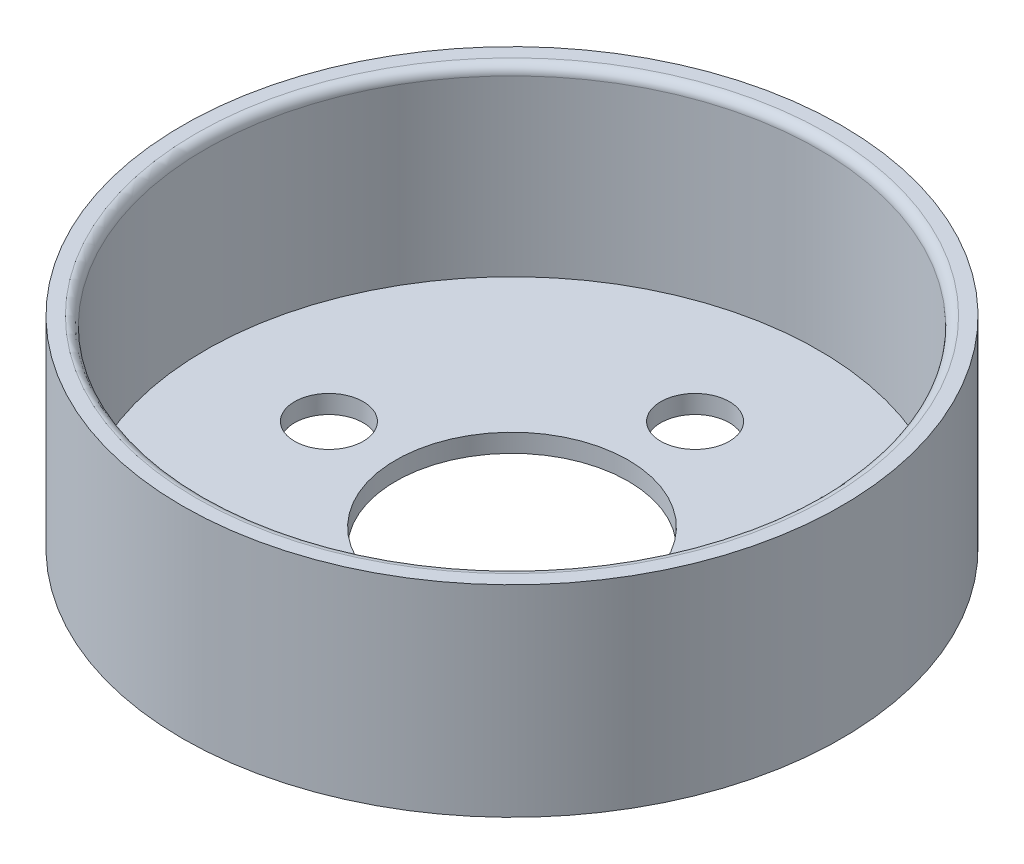
ISO-10303-21;
HEADER;
FILE_DESCRIPTION(('STEP AP214'),'2;1');
FILE_NAME('part.step','',(''),(''),'','','');
FILE_SCHEMA(('AUTOMOTIVE_DESIGN { 1 0 10303 214 1 1 1 1 }'));
ENDSEC;
DATA;
#1=APPLICATION_CONTEXT('core data for automotive mechanical design processes');
#2=APPLICATION_PROTOCOL_DEFINITION('international standard','automotive_design',2000,#1);
#3=PRODUCT_CONTEXT('',#1,'mechanical');
#4=PRODUCT('Part','Part','',(#3));
#5=PRODUCT_RELATED_PRODUCT_CATEGORY('part','',(#4));
#6=PRODUCT_DEFINITION_FORMATION('','',#4);
#7=PRODUCT_DEFINITION_CONTEXT('part definition',#1,'design');
#8=PRODUCT_DEFINITION('design','',#6,#7);
#9=PRODUCT_DEFINITION_SHAPE('','',#8);
#10=(LENGTH_UNIT() NAMED_UNIT(*) SI_UNIT(.MILLI.,.METRE.));
#11=(NAMED_UNIT(*) PLANE_ANGLE_UNIT() SI_UNIT($,.RADIAN.));
#12=(NAMED_UNIT(*) SI_UNIT($,.STERADIAN.) SOLID_ANGLE_UNIT());
#13=UNCERTAINTY_MEASURE_WITH_UNIT(LENGTH_MEASURE(1.E-05),#10,'distance_accuracy_value','');
#14=(GEOMETRIC_REPRESENTATION_CONTEXT(3) GLOBAL_UNCERTAINTY_ASSIGNED_CONTEXT((#13)) GLOBAL_UNIT_ASSIGNED_CONTEXT((#10,
#11,#12)) REPRESENTATION_CONTEXT('',''));
#15=CARTESIAN_POINT('',(0.,0.,0.));
#16=DIRECTION('',(0.,0.,1.));
#17=DIRECTION('',(1.,0.,0.));
#18=AXIS2_PLACEMENT_3D('',#15,#16,#17);
#19=CARTESIAN_POINT('',(0.,2.54,0.));
#20=DIRECTION('',(0.,-1.,0.));
#21=DIRECTION('',(0.,0.,-1.));
#22=AXIS2_PLACEMENT_3D('',#19,#20,#21);
#23=CYLINDRICAL_SURFACE('',#22,45.72);
#24=CARTESIAN_POINT('',(0.,0.,0.));
#25=DIRECTION('',(0.,1.,0.));
#26=DIRECTION('',(0.,0.,1.));
#27=AXIS2_PLACEMENT_3D('',#24,#25,#26);
#28=CIRCLE('',#27,45.72);
#29=CARTESIAN_POINT('',(0.,0.,45.72));
#30=VERTEX_POINT('',#29);
#31=EDGE_CURVE('E61',#30,#30,#28,.T.);
#32=ORIENTED_EDGE('',*,*,#31,.T.);
#33=EDGE_LOOP('',(#32));
#34=FACE_BOUND('',#33,.T.);
#35=CARTESIAN_POINT('',(0.,27.94,0.));
#36=DIRECTION('',(0.,1.,0.));
#37=DIRECTION('',(0.,0.,1.));
#38=AXIS2_PLACEMENT_3D('',#35,#36,#37);
#39=CIRCLE('',#38,45.72);
#40=CARTESIAN_POINT('',(0.,27.94,45.72));
#41=VERTEX_POINT('',#40);
#42=EDGE_CURVE('E67',#41,#41,#39,.T.);
#43=ORIENTED_EDGE('',*,*,#42,.F.);
#44=EDGE_LOOP('',(#43));
#45=FACE_BOUND('',#44,.T.);
#46=ADVANCED_FACE('F43',(#34,#45),#23,.T.);
#47=CARTESIAN_POINT('',(0.,0.,0.));
#48=DIRECTION('',(0.,1.,0.));
#49=DIRECTION('',(0.,0.,1.));
#50=AXIS2_PLACEMENT_3D('',#47,#48,#49);
#51=PLANE('',#50);
#52=CARTESIAN_POINT('',(25.4,0.,0.));
#53=DIRECTION('',(0.,1.,0.));
#54=DIRECTION('',(0.,0.,1.));
#55=AXIS2_PLACEMENT_3D('',#52,#53,#54);
#56=CIRCLE('',#55,4.7625);
#57=CARTESIAN_POINT('',(25.4,0.,4.76250000000009));
#58=VERTEX_POINT('',#57);
#59=EDGE_CURVE('E87',#58,#58,#56,.F.);
#60=ORIENTED_EDGE('',*,*,#59,.F.);
#61=EDGE_LOOP('',(#60));
#62=FACE_BOUND('',#61,.T.);
#63=CARTESIAN_POINT('',(0.,0.,25.4));
#64=DIRECTION('',(0.,1.,0.));
#65=DIRECTION('',(0.,0.,1.));
#66=AXIS2_PLACEMENT_3D('',#63,#64,#65);
#67=CIRCLE('',#66,4.7625);
#68=CARTESIAN_POINT('',(0.,0.,30.1625));
#69=VERTEX_POINT('',#68);
#70=EDGE_CURVE('E97',#69,#69,#67,.F.);
#71=ORIENTED_EDGE('',*,*,#70,.F.);
#72=EDGE_LOOP('',(#71));
#73=FACE_BOUND('',#72,.T.);
#74=CARTESIAN_POINT('',(-25.4,0.,-2.66050878019847E-13));
#75=DIRECTION('',(0.,1.,0.));
#76=DIRECTION('',(0.,0.,1.));
#77=AXIS2_PLACEMENT_3D('',#74,#75,#76);
#78=CIRCLE('',#77,4.7625);
#79=CARTESIAN_POINT('',(-25.4,0.,4.76249999999973));
#80=VERTEX_POINT('',#79);
#81=EDGE_CURVE('E88',#80,#80,#78,.F.);
#82=ORIENTED_EDGE('',*,*,#81,.F.);
#83=EDGE_LOOP('',(#82));
#84=FACE_BOUND('',#83,.T.);
#85=CARTESIAN_POINT('',(0.,0.,-25.4));
#86=DIRECTION('',(0.,1.,0.));
#87=DIRECTION('',(0.,0.,1.));
#88=AXIS2_PLACEMENT_3D('',#85,#86,#87);
#89=CIRCLE('',#88,4.7625);
#90=CARTESIAN_POINT('',(0.,0.,-20.6375));
#91=VERTEX_POINT('',#90);
#92=EDGE_CURVE('E76',#91,#91,#89,.F.);
#93=ORIENTED_EDGE('',*,*,#92,.F.);
#94=EDGE_LOOP('',(#93));
#95=FACE_BOUND('',#94,.T.);
#96=CARTESIAN_POINT('',(0.,0.,0.));
#97=DIRECTION('',(0.,-1.,0.));
#98=DIRECTION('',(0.,0.,-1.));
#99=AXIS2_PLACEMENT_3D('',#96,#97,#98);
#100=CIRCLE('',#99,16.129);
#101=CARTESIAN_POINT('',(0.,0.,-16.129));
#102=VERTEX_POINT('',#101);
#103=EDGE_CURVE('E71',#102,#102,#100,.T.);
#104=ORIENTED_EDGE('',*,*,#103,.F.);
#105=EDGE_LOOP('',(#104));
#106=FACE_BOUND('',#105,.T.);
#107=ORIENTED_EDGE('',*,*,#31,.F.);
#108=EDGE_LOOP('',(#107));
#109=FACE_BOUND('',#108,.T.);
#110=ADVANCED_FACE('F137',(#62,#73,#84,#95,#106,#109),#51,.F.);
#111=CARTESIAN_POINT('',(0.,27.94,0.));
#112=DIRECTION('',(0.,1.,0.));
#113=DIRECTION('',(0.,0.,1.));
#114=AXIS2_PLACEMENT_3D('',#111,#112,#113);
#115=PLANE('',#114);
#116=CARTESIAN_POINT('',(0.,27.94,0.));
#117=DIRECTION('',(0.,1.,0.));
#118=DIRECTION('',(0.,0.,1.));
#119=AXIS2_PLACEMENT_3D('',#116,#117,#118);
#120=CIRCLE('',#119,43.815);
#121=CARTESIAN_POINT('',(0.,27.94,43.815));
#122=VERTEX_POINT('',#121);
#123=EDGE_CURVE('E10',#122,#122,#120,.F.);
#124=ORIENTED_EDGE('',*,*,#123,.T.);
#125=EDGE_LOOP('',(#124));
#126=FACE_BOUND('',#125,.T.);
#127=ORIENTED_EDGE('',*,*,#42,.T.);
#128=EDGE_LOOP('',(#127));
#129=FACE_BOUND('',#128,.T.);
#130=ADVANCED_FACE('F132',(#126,#129),#115,.T.);
#131=CARTESIAN_POINT('',(0.,27.94,0.));
#132=DIRECTION('',(0.,-1.,0.));
#133=DIRECTION('',(0.,0.,-1.));
#134=AXIS2_PLACEMENT_3D('',#131,#132,#133);
#135=CYLINDRICAL_SURFACE('',#134,42.545);
#136=CARTESIAN_POINT('',(0.,26.67,0.));
#137=DIRECTION('',(0.,1.,0.));
#138=DIRECTION('',(0.,0.,1.));
#139=AXIS2_PLACEMENT_3D('',#136,#137,#138);
#140=CIRCLE('',#139,42.545);
#141=CARTESIAN_POINT('',(0.,26.67,42.545));
#142=VERTEX_POINT('',#141);
#143=EDGE_CURVE('E51',#142,#142,#140,.T.);
#144=ORIENTED_EDGE('',*,*,#143,.T.);
#145=EDGE_LOOP('',(#144));
#146=FACE_BOUND('',#145,.T.);
#147=CARTESIAN_POINT('',(0.,2.54,0.));
#148=DIRECTION('',(0.,1.,0.));
#149=DIRECTION('',(0.,0.,1.));
#150=AXIS2_PLACEMENT_3D('',#147,#148,#149);
#151=CIRCLE('',#150,42.545);
#152=CARTESIAN_POINT('',(0.,2.54,42.545));
#153=VERTEX_POINT('',#152);
#154=EDGE_CURVE('E56',#153,#153,#151,.F.);
#155=ORIENTED_EDGE('',*,*,#154,.T.);
#156=EDGE_LOOP('',(#155));
#157=FACE_BOUND('',#156,.T.);
#158=ADVANCED_FACE('F119',(#146,#157),#135,.F.);
#159=CARTESIAN_POINT('',(0.,2.54,0.));
#160=DIRECTION('',(0.,1.,0.));
#161=DIRECTION('',(0.,0.,1.));
#162=AXIS2_PLACEMENT_3D('',#159,#160,#161);
#163=PLANE('',#162);
#164=CARTESIAN_POINT('',(25.4,2.54,0.));
#165=DIRECTION('',(0.,1.,0.));
#166=DIRECTION('',(-1.,0.,0.));
#167=AXIS2_PLACEMENT_3D('',#164,#165,#166);
#168=CIRCLE('',#167,4.7625);
#169=CARTESIAN_POINT('',(20.6375,2.54,0.));
#170=VERTEX_POINT('',#169);
#171=EDGE_CURVE('E101',#170,#170,#168,.T.);
#172=ORIENTED_EDGE('',*,*,#171,.F.);
#173=EDGE_LOOP('',(#172));
#174=FACE_BOUND('',#173,.T.);
#175=CARTESIAN_POINT('',(0.,2.54,25.4));
#176=DIRECTION('',(0.,1.,0.));
#177=DIRECTION('',(0.,0.,-1.));
#178=AXIS2_PLACEMENT_3D('',#175,#176,#177);
#179=CIRCLE('',#178,4.7625);
#180=CARTESIAN_POINT('',(0.,2.54,20.6375));
#181=VERTEX_POINT('',#180);
#182=EDGE_CURVE('E92',#181,#181,#179,.T.);
#183=ORIENTED_EDGE('',*,*,#182,.F.);
#184=EDGE_LOOP('',(#183));
#185=FACE_BOUND('',#184,.T.);
#186=CARTESIAN_POINT('',(-25.4,2.54,-2.66050878019847E-13));
#187=DIRECTION('',(0.,1.,0.));
#188=DIRECTION('',(1.,0.,0.));
#189=AXIS2_PLACEMENT_3D('',#186,#187,#188);
#190=CIRCLE('',#189,4.7625);
#191=CARTESIAN_POINT('',(-20.6375,2.54,-2.16166338391125E-13));
#192=VERTEX_POINT('',#191);
#193=EDGE_CURVE('E93',#192,#192,#190,.T.);
#194=ORIENTED_EDGE('',*,*,#193,.F.);
#195=EDGE_LOOP('',(#194));
#196=FACE_BOUND('',#195,.T.);
#197=CARTESIAN_POINT('',(0.,2.54,-25.4));
#198=DIRECTION('',(0.,1.,0.));
#199=DIRECTION('',(0.,0.,1.));
#200=AXIS2_PLACEMENT_3D('',#197,#198,#199);
#201=CIRCLE('',#200,4.7625);
#202=CARTESIAN_POINT('',(0.,2.54,-20.6375));
#203=VERTEX_POINT('',#202);
#204=EDGE_CURVE('E83',#203,#203,#201,.T.);
#205=ORIENTED_EDGE('',*,*,#204,.F.);
#206=EDGE_LOOP('',(#205));
#207=FACE_BOUND('',#206,.T.);
#208=CARTESIAN_POINT('',(0.,2.54,0.));
#209=DIRECTION('',(0.,1.,0.));
#210=DIRECTION('',(0.,0.,1.));
#211=AXIS2_PLACEMENT_3D('',#208,#209,#210);
#212=CIRCLE('',#211,16.129);
#213=CARTESIAN_POINT('',(0.,2.54,16.129));
#214=VERTEX_POINT('',#213);
#215=EDGE_CURVE('E72',#214,#214,#212,.F.);
#216=ORIENTED_EDGE('',*,*,#215,.T.);
#217=EDGE_LOOP('',(#216));
#218=FACE_BOUND('',#217,.T.);
#219=ORIENTED_EDGE('',*,*,#154,.F.);
#220=EDGE_LOOP('',(#219));
#221=FACE_BOUND('',#220,.T.);
#222=ADVANCED_FACE('F115',(#174,#185,#196,#207,#218,#221),#163,.T.);
#223=CARTESIAN_POINT('',(0.,27.941,0.));
#224=DIRECTION('',(0.,-1.,0.));
#225=DIRECTION('',(0.,0.,-1.));
#226=AXIS2_PLACEMENT_3D('',#223,#224,#225);
#227=CYLINDRICAL_SURFACE('',#226,16.129);
#228=ORIENTED_EDGE('',*,*,#215,.F.);
#229=EDGE_LOOP('',(#228));
#230=FACE_BOUND('',#229,.T.);
#231=ORIENTED_EDGE('',*,*,#103,.T.);
#232=EDGE_LOOP('',(#231));
#233=FACE_BOUND('',#232,.T.);
#234=ADVANCED_FACE('F118',(#230,#233),#227,.F.);
#235=CARTESIAN_POINT('',(0.,26.67,0.));
#236=DIRECTION('',(0.,1.,0.));
#237=DIRECTION('',(0.,0.,1.));
#238=AXIS2_PLACEMENT_3D('',#235,#236,#237);
#239=TOROIDAL_SURFACE('',#238,43.815,1.27);
#240=ORIENTED_EDGE('',*,*,#123,.F.);
#241=EDGE_LOOP('',(#240));
#242=FACE_BOUND('',#241,.T.);
#243=ORIENTED_EDGE('',*,*,#143,.F.);
#244=EDGE_LOOP('',(#243));
#245=FACE_BOUND('',#244,.T.);
#246=ADVANCED_FACE('F45',(#242,#245),#239,.T.);
#247=CARTESIAN_POINT('',(0.,-0.00100000000000013,-25.4));
#248=DIRECTION('',(0.,1.,0.));
#249=DIRECTION('',(0.,0.,1.));
#250=AXIS2_PLACEMENT_3D('',#247,#248,#249);
#251=CYLINDRICAL_SURFACE('',#250,4.7625);
#252=ORIENTED_EDGE('',*,*,#204,.T.);
#253=EDGE_LOOP('',(#252));
#254=FACE_BOUND('',#253,.T.);
#255=ORIENTED_EDGE('',*,*,#92,.T.);
#256=EDGE_LOOP('',(#255));
#257=FACE_BOUND('',#256,.T.);
#258=ADVANCED_FACE('F169',(#254,#257),#251,.F.);
#259=CARTESIAN_POINT('',(-25.4,-0.00100000000000013,-2.66050878019847E-13));
#260=DIRECTION('',(0.,1.,0.));
#261=DIRECTION('',(0.,0.,1.));
#262=AXIS2_PLACEMENT_3D('',#259,#260,#261);
#263=CYLINDRICAL_SURFACE('',#262,4.7625);
#264=ORIENTED_EDGE('',*,*,#193,.T.);
#265=EDGE_LOOP('',(#264));
#266=FACE_BOUND('',#265,.T.);
#267=ORIENTED_EDGE('',*,*,#81,.T.);
#268=EDGE_LOOP('',(#267));
#269=FACE_BOUND('',#268,.T.);
#270=ADVANCED_FACE('F174',(#266,#269),#263,.F.);
#271=CARTESIAN_POINT('',(0.,-0.00100000000000013,25.4));
#272=DIRECTION('',(0.,1.,0.));
#273=DIRECTION('',(0.,0.,1.));
#274=AXIS2_PLACEMENT_3D('',#271,#272,#273);
#275=CYLINDRICAL_SURFACE('',#274,4.7625);
#276=ORIENTED_EDGE('',*,*,#182,.T.);
#277=EDGE_LOOP('',(#276));
#278=FACE_BOUND('',#277,.T.);
#279=ORIENTED_EDGE('',*,*,#70,.T.);
#280=EDGE_LOOP('',(#279));
#281=FACE_BOUND('',#280,.T.);
#282=ADVANCED_FACE('F178',(#278,#281),#275,.F.);
#283=CARTESIAN_POINT('',(25.4,-0.00100000000000013,0.));
#284=DIRECTION('',(0.,1.,0.));
#285=DIRECTION('',(0.,0.,1.));
#286=AXIS2_PLACEMENT_3D('',#283,#284,#285);
#287=CYLINDRICAL_SURFACE('',#286,4.7625);
#288=ORIENTED_EDGE('',*,*,#171,.T.);
#289=EDGE_LOOP('',(#288));
#290=FACE_BOUND('',#289,.T.);
#291=ORIENTED_EDGE('',*,*,#59,.T.);
#292=EDGE_LOOP('',(#291));
#293=FACE_BOUND('',#292,.T.);
#294=ADVANCED_FACE('F112',(#290,#293),#287,.F.);
#295=CLOSED_SHELL('',(#46,#110,#130,#158,#222,#234,#246,#258,#270,#282,#294));
#296=MANIFOLD_SOLID_BREP('B2',#295);
#297=ADVANCED_BREP_SHAPE_REPRESENTATION('',(#18,#296),#14);
#298=SHAPE_DEFINITION_REPRESENTATION(#9,#297);
ENDSEC;
END-ISO-10303-21;
